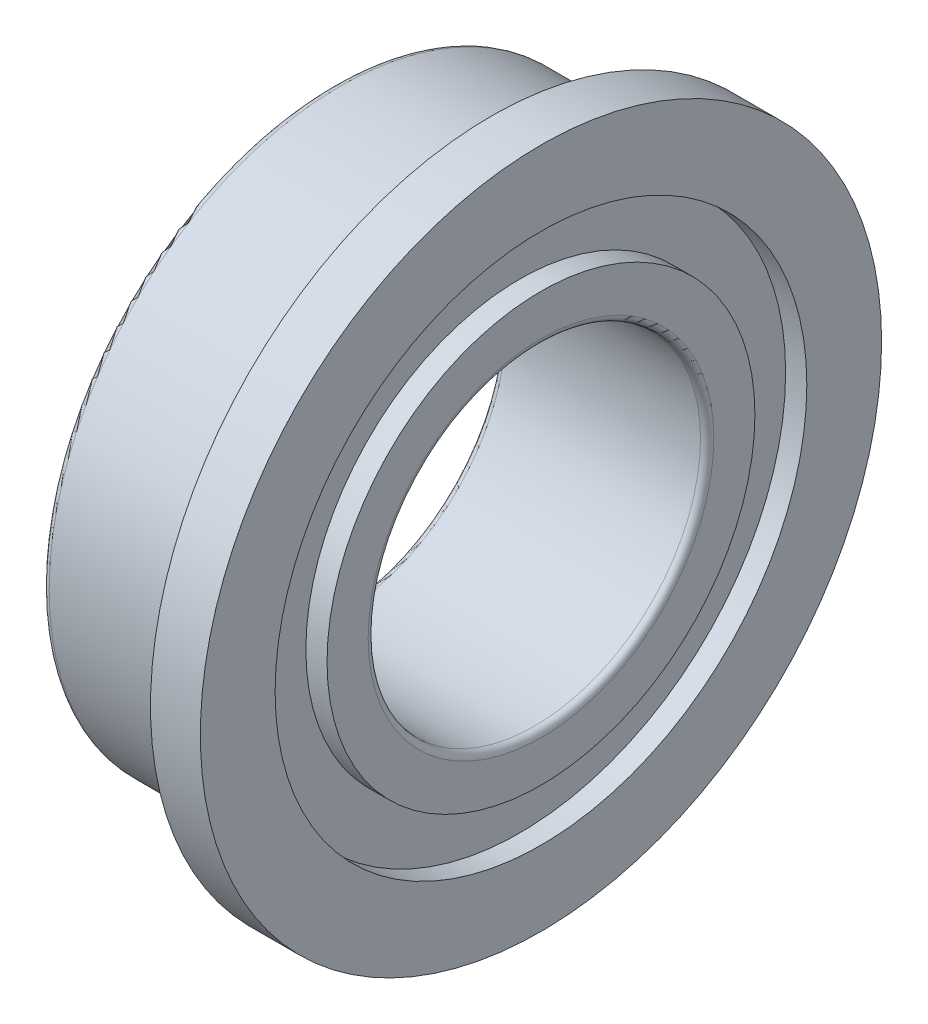
ISO-10303-21;
HEADER;
FILE_DESCRIPTION(('STEP AP214'),'2;1');
FILE_NAME('part.step','',(''),(''),'','','');
FILE_SCHEMA(('AUTOMOTIVE_DESIGN { 1 0 10303 214 1 1 1 1 }'));
ENDSEC;
DATA;
#1=APPLICATION_CONTEXT('core data for automotive mechanical design processes');
#2=APPLICATION_PROTOCOL_DEFINITION('international standard','automotive_design',2000,#1);
#3=PRODUCT_CONTEXT('',#1,'mechanical');
#4=PRODUCT('Part','Part','',(#3));
#5=PRODUCT_RELATED_PRODUCT_CATEGORY('part','',(#4));
#6=PRODUCT_DEFINITION_FORMATION('','',#4);
#7=PRODUCT_DEFINITION_CONTEXT('part definition',#1,'design');
#8=PRODUCT_DEFINITION('design','',#6,#7);
#9=PRODUCT_DEFINITION_SHAPE('','',#8);
#10=(LENGTH_UNIT() NAMED_UNIT(*) SI_UNIT(.MILLI.,.METRE.));
#11=(NAMED_UNIT(*) PLANE_ANGLE_UNIT() SI_UNIT($,.RADIAN.));
#12=(NAMED_UNIT(*) SI_UNIT($,.STERADIAN.) SOLID_ANGLE_UNIT());
#13=UNCERTAINTY_MEASURE_WITH_UNIT(LENGTH_MEASURE(1.E-05),#10,'distance_accuracy_value','');
#14=(GEOMETRIC_REPRESENTATION_CONTEXT(3) GLOBAL_UNCERTAINTY_ASSIGNED_CONTEXT((#13)) GLOBAL_UNIT_ASSIGNED_CONTEXT((#10,
#11,#12)) REPRESENTATION_CONTEXT('',''));
#15=CARTESIAN_POINT('',(0.,0.,0.));
#16=DIRECTION('',(0.,0.,1.));
#17=DIRECTION('',(1.,0.,0.));
#18=AXIS2_PLACEMENT_3D('',#15,#16,#17);
#19=CARTESIAN_POINT('',(0.255,2.8875,0.));
#20=DIRECTION('',(-1.,0.,0.));
#21=DIRECTION('',(0.,0.,1.));
#22=AXIS2_PLACEMENT_3D('',#19,#20,#21);
#23=PLANE('',#22);
#24=CARTESIAN_POINT('',(0.255,0.,0.));
#25=DIRECTION('',(1.,0.,0.));
#26=DIRECTION('',(0.,0.,-1.));
#27=AXIS2_PLACEMENT_3D('',#24,#25,#26);
#28=CIRCLE('',#27,3.2);
#29=CARTESIAN_POINT('',(0.255,0.,-3.2));
#30=VERTEX_POINT('',#29);
#31=EDGE_CURVE('E310',#30,#30,#28,.F.);
#32=ORIENTED_EDGE('',*,*,#31,.T.);
#33=EDGE_LOOP('',(#32));
#34=FACE_BOUND('',#33,.T.);
#35=CARTESIAN_POINT('',(0.255,0.,0.));
#36=DIRECTION('',(1.,0.,0.));
#37=DIRECTION('',(0.,0.,-1.));
#38=AXIS2_PLACEMENT_3D('',#35,#36,#37);
#39=CIRCLE('',#38,2.575);
#40=CARTESIAN_POINT('',(0.255,0.,-2.575));
#41=VERTEX_POINT('',#40);
#42=EDGE_CURVE('E313',#41,#41,#39,.F.);
#43=ORIENTED_EDGE('',*,*,#42,.F.);
#44=EDGE_LOOP('',(#43));
#45=FACE_BOUND('',#44,.T.);
#46=ADVANCED_FACE('F16',(#34,#45),#23,.T.);
#47=CARTESIAN_POINT('',(0.1275,0.,0.));
#48=DIRECTION('',(1.,0.,0.));
#49=DIRECTION('',(0.,0.,-1.));
#50=AXIS2_PLACEMENT_3D('',#47,#48,#49);
#51=CYLINDRICAL_SURFACE('',#50,2.575);
#52=CARTESIAN_POINT('',(0.,0.,0.));
#53=DIRECTION('',(1.,0.,0.));
#54=DIRECTION('',(0.,0.,-1.));
#55=AXIS2_PLACEMENT_3D('',#52,#53,#54);
#56=CIRCLE('',#55,2.575);
#57=CARTESIAN_POINT('',(0.,0.,-2.575));
#58=VERTEX_POINT('',#57);
#59=EDGE_CURVE('E307',#58,#58,#56,.F.);
#60=ORIENTED_EDGE('',*,*,#59,.F.);
#61=EDGE_LOOP('',(#60));
#62=FACE_BOUND('',#61,.T.);
#63=ORIENTED_EDGE('',*,*,#42,.T.);
#64=EDGE_LOOP('',(#63));
#65=FACE_BOUND('',#64,.T.);
#66=ADVANCED_FACE('F341',(#62,#65),#51,.T.);
#67=CARTESIAN_POINT('',(0.1275,0.,0.));
#68=DIRECTION('',(1.,0.,0.));
#69=DIRECTION('',(0.,0.,-1.));
#70=AXIS2_PLACEMENT_3D('',#67,#68,#69);
#71=CYLINDRICAL_SURFACE('',#70,3.2);
#72=ORIENTED_EDGE('',*,*,#31,.F.);
#73=EDGE_LOOP('',(#72));
#74=FACE_BOUND('',#73,.T.);
#75=CARTESIAN_POINT('',(0.,0.,0.));
#76=DIRECTION('',(1.,0.,0.));
#77=DIRECTION('',(0.,0.,-1.));
#78=AXIS2_PLACEMENT_3D('',#75,#76,#77);
#79=CIRCLE('',#78,3.2);
#80=CARTESIAN_POINT('',(0.,0.,-3.2));
#81=VERTEX_POINT('',#80);
#82=EDGE_CURVE('E70',#81,#81,#79,.T.);
#83=ORIENTED_EDGE('',*,*,#82,.F.);
#84=EDGE_LOOP('',(#83));
#85=FACE_BOUND('',#84,.T.);
#86=ADVANCED_FACE('F93',(#74,#85),#71,.F.);
#87=CARTESIAN_POINT('',(0.,2.3275,0.));
#88=DIRECTION('',(-1.,0.,0.));
#89=DIRECTION('',(0.,0.,1.));
#90=AXIS2_PLACEMENT_3D('',#87,#88,#89);
#91=PLANE('',#90);
#92=ORIENTED_EDGE('',*,*,#59,.T.);
#93=EDGE_LOOP('',(#92));
#94=FACE_BOUND('',#93,.T.);
#95=CARTESIAN_POINT('',(0.,0.,0.));
#96=DIRECTION('',(-1.,0.,0.));
#97=DIRECTION('',(0.,0.,1.));
#98=AXIS2_PLACEMENT_3D('',#95,#96,#97);
#99=CIRCLE('',#98,2.08);
#100=CARTESIAN_POINT('',(0.,0.,2.08));
#101=VERTEX_POINT('',#100);
#102=CARTESIAN_POINT('',(0.,2.08,0.));
#103=VERTEX_POINT('',#102);
#104=EDGE_CURVE('E64',#101,#103,#99,.T.);
#105=ORIENTED_EDGE('',*,*,#104,.F.);
#106=CARTESIAN_POINT('',(0.,0.,0.));
#107=DIRECTION('',(-1.,0.,0.));
#108=DIRECTION('',(0.,0.,-1.));
#109=AXIS2_PLACEMENT_3D('',#106,#107,#108);
#110=CIRCLE('',#109,2.08);
#111=CARTESIAN_POINT('',(0.,0.,-2.08));
#112=VERTEX_POINT('',#111);
#113=EDGE_CURVE('E60',#112,#101,#110,.T.);
#114=ORIENTED_EDGE('',*,*,#113,.F.);
#115=CARTESIAN_POINT('',(0.,0.,0.));
#116=DIRECTION('',(-1.,0.,0.));
#117=DIRECTION('',(0.,1.,0.));
#118=AXIS2_PLACEMENT_3D('',#115,#116,#117);
#119=CIRCLE('',#118,2.08);
#120=EDGE_CURVE('E66',#103,#112,#119,.T.);
#121=ORIENTED_EDGE('',*,*,#120,.F.);
#122=EDGE_LOOP('',(#105,#114,#121));
#123=FACE_BOUND('',#122,.T.);
#124=ADVANCED_FACE('F73',(#94,#123),#91,.T.);
#125=CARTESIAN_POINT('',(0.,3.31,0.));
#126=DIRECTION('',(-1.,0.,0.));
#127=DIRECTION('',(0.,0.,1.));
#128=AXIS2_PLACEMENT_3D('',#125,#126,#127);
#129=PLANE('',#128);
#130=CARTESIAN_POINT('',(0.,0.,0.));
#131=DIRECTION('',(1.,0.,0.));
#132=DIRECTION('',(0.,0.,1.));
#133=AXIS2_PLACEMENT_3D('',#130,#131,#132);
#134=CIRCLE('',#133,3.42);
#135=CARTESIAN_POINT('',(0.,0.,3.42));
#136=VERTEX_POINT('',#135);
#137=CARTESIAN_POINT('',(0.,0.,-3.42));
#138=VERTEX_POINT('',#137);
#139=EDGE_CURVE('E143',#136,#138,#134,.T.);
#140=ORIENTED_EDGE('',*,*,#139,.F.);
#141=CARTESIAN_POINT('',(0.,0.,0.));
#142=DIRECTION('',(1.,0.,0.));
#143=DIRECTION('',(0.,1.,0.));
#144=AXIS2_PLACEMENT_3D('',#141,#142,#143);
#145=CIRCLE('',#144,3.42);
#146=CARTESIAN_POINT('',(0.,3.42,0.));
#147=VERTEX_POINT('',#146);
#148=EDGE_CURVE('E153',#147,#136,#145,.T.);
#149=ORIENTED_EDGE('',*,*,#148,.F.);
#150=CARTESIAN_POINT('',(0.,0.,0.));
#151=DIRECTION('',(1.,0.,0.));
#152=DIRECTION('',(0.,0.,-1.));
#153=AXIS2_PLACEMENT_3D('',#150,#151,#152);
#154=CIRCLE('',#153,3.42);
#155=EDGE_CURVE('E132',#138,#147,#154,.T.);
#156=ORIENTED_EDGE('',*,*,#155,.F.);
#157=EDGE_LOOP('',(#140,#149,#156));
#158=FACE_BOUND('',#157,.T.);
#159=ORIENTED_EDGE('',*,*,#82,.T.);
#160=EDGE_LOOP('',(#159));
#161=FACE_BOUND('',#160,.T.);
#162=ADVANCED_FACE('F92',(#158,#161),#129,.T.);
#163=CARTESIAN_POINT('',(0.0800000000000004,0.,0.));
#164=DIRECTION('',(-1.,0.,0.));
#165=DIRECTION('',(0.,0.,1.));
#166=AXIS2_PLACEMENT_3D('',#163,#164,#165);
#167=TOROIDAL_SURFACE('',#166,2.08,0.0800000000000004);
#168=ORIENTED_EDGE('',*,*,#113,.T.);
#169=ORIENTED_EDGE('',*,*,#104,.T.);
#170=ORIENTED_EDGE('',*,*,#120,.T.);
#171=EDGE_LOOP('',(#168,#169,#170));
#172=FACE_BOUND('',#171,.T.);
#173=CARTESIAN_POINT('',(0.08,0.,0.));
#174=DIRECTION('',(1.,0.,0.));
#175=DIRECTION('',(0.,0.,-1.));
#176=AXIS2_PLACEMENT_3D('',#173,#174,#175);
#177=CIRCLE('',#176,2.);
#178=CARTESIAN_POINT('',(0.08,0.,-2.));
#179=VERTEX_POINT('',#178);
#180=EDGE_CURVE('E127',#179,#179,#177,.T.);
#181=ORIENTED_EDGE('',*,*,#180,.T.);
#182=EDGE_LOOP('',(#181));
#183=FACE_BOUND('',#182,.T.);
#184=ADVANCED_FACE('F62',(#172,#183),#167,.T.);
#185=CARTESIAN_POINT('',(0.0800000000000006,0.,0.));
#186=DIRECTION('',(-1.,0.,0.));
#187=DIRECTION('',(0.,0.,1.));
#188=AXIS2_PLACEMENT_3D('',#185,#186,#187);
#189=TOROIDAL_SURFACE('',#188,3.42,0.0800000000000005);
#190=ORIENTED_EDGE('',*,*,#148,.T.);
#191=ORIENTED_EDGE('',*,*,#139,.T.);
#192=ORIENTED_EDGE('',*,*,#155,.T.);
#193=EDGE_LOOP('',(#190,#191,#192));
#194=FACE_BOUND('',#193,.T.);
#195=CARTESIAN_POINT('',(0.0800000000000001,0.,0.));
#196=DIRECTION('',(1.,0.,0.));
#197=DIRECTION('',(0.,0.,-1.));
#198=AXIS2_PLACEMENT_3D('',#195,#196,#197);
#199=CIRCLE('',#198,3.5);
#200=CARTESIAN_POINT('',(0.0800000000000001,0.,-3.5));
#201=VERTEX_POINT('',#200);
#202=EDGE_CURVE('E175',#201,#201,#199,.T.);
#203=ORIENTED_EDGE('',*,*,#202,.F.);
#204=EDGE_LOOP('',(#203));
#205=FACE_BOUND('',#204,.T.);
#206=ADVANCED_FACE('F118',(#194,#205),#189,.T.);
#207=CARTESIAN_POINT('',(1.25,0.,0.));
#208=DIRECTION('',(1.,0.,0.));
#209=DIRECTION('',(0.,0.,-1.));
#210=AXIS2_PLACEMENT_3D('',#207,#208,#209);
#211=CYLINDRICAL_SURFACE('',#210,2.);
#212=ORIENTED_EDGE('',*,*,#180,.F.);
#213=EDGE_LOOP('',(#212));
#214=FACE_BOUND('',#213,.T.);
#215=CARTESIAN_POINT('',(2.42,0.,0.));
#216=DIRECTION('',(-1.,0.,0.));
#217=DIRECTION('',(0.,0.,1.));
#218=AXIS2_PLACEMENT_3D('',#215,#216,#217);
#219=CIRCLE('',#218,2.);
#220=CARTESIAN_POINT('',(2.42,0.,2.));
#221=VERTEX_POINT('',#220);
#222=EDGE_CURVE('E178',#221,#221,#219,.T.);
#223=ORIENTED_EDGE('',*,*,#222,.F.);
#224=EDGE_LOOP('',(#223));
#225=FACE_BOUND('',#224,.T.);
#226=ADVANCED_FACE('F372',(#214,#225),#211,.F.);
#227=CARTESIAN_POINT('',(0.949999999999999,0.,0.));
#228=DIRECTION('',(1.,0.,0.));
#229=DIRECTION('',(0.,0.,-1.));
#230=AXIS2_PLACEMENT_3D('',#227,#228,#229);
#231=CYLINDRICAL_SURFACE('',#230,3.5);
#232=ORIENTED_EDGE('',*,*,#202,.T.);
#233=EDGE_LOOP('',(#232));
#234=FACE_BOUND('',#233,.T.);
#235=CARTESIAN_POINT('',(1.82,0.,0.));
#236=DIRECTION('',(-1.,0.,0.));
#237=DIRECTION('',(0.,0.,1.));
#238=AXIS2_PLACEMENT_3D('',#235,#236,#237);
#239=CIRCLE('',#238,3.5);
#240=CARTESIAN_POINT('',(1.82,0.,3.5));
#241=VERTEX_POINT('',#240);
#242=EDGE_CURVE('E183',#241,#241,#239,.T.);
#243=ORIENTED_EDGE('',*,*,#242,.T.);
#244=EDGE_LOOP('',(#243));
#245=FACE_BOUND('',#244,.T.);
#246=ADVANCED_FACE('F207',(#234,#245),#231,.T.);
#247=CARTESIAN_POINT('',(2.42,0.,0.));
#248=DIRECTION('',(-1.,0.,0.));
#249=DIRECTION('',(0.,0.,1.));
#250=AXIS2_PLACEMENT_3D('',#247,#248,#249);
#251=TOROIDAL_SURFACE('',#250,2.08,0.080000000000001);
#252=ORIENTED_EDGE('',*,*,#222,.T.);
#253=EDGE_LOOP('',(#252));
#254=FACE_BOUND('',#253,.T.);
#255=CARTESIAN_POINT('',(2.5,0.,0.));
#256=DIRECTION('',(1.,0.,0.));
#257=DIRECTION('',(0.,0.,-1.));
#258=AXIS2_PLACEMENT_3D('',#255,#256,#257);
#259=CIRCLE('',#258,2.08);
#260=CARTESIAN_POINT('',(2.5,2.08,0.));
#261=VERTEX_POINT('',#260);
#262=CARTESIAN_POINT('',(2.5,0.,-2.08));
#263=VERTEX_POINT('',#262);
#264=EDGE_CURVE('E189',#261,#263,#259,.F.);
#265=ORIENTED_EDGE('',*,*,#264,.F.);
#266=CARTESIAN_POINT('',(2.5,0.,0.));
#267=DIRECTION('',(1.,0.,0.));
#268=DIRECTION('',(0.,1.,0.));
#269=AXIS2_PLACEMENT_3D('',#266,#267,#268);
#270=CIRCLE('',#269,2.08);
#271=CARTESIAN_POINT('',(2.5,0.,2.08));
#272=VERTEX_POINT('',#271);
#273=EDGE_CURVE('E36',#272,#261,#270,.F.);
#274=ORIENTED_EDGE('',*,*,#273,.F.);
#275=CARTESIAN_POINT('',(2.5,0.,0.));
#276=DIRECTION('',(1.,0.,0.));
#277=DIRECTION('',(0.,0.,1.));
#278=AXIS2_PLACEMENT_3D('',#275,#276,#277);
#279=CIRCLE('',#278,2.08);
#280=EDGE_CURVE('E242',#263,#272,#279,.F.);
#281=ORIENTED_EDGE('',*,*,#280,.F.);
#282=EDGE_LOOP('',(#265,#274,#281));
#283=FACE_BOUND('',#282,.T.);
#284=ADVANCED_FACE('F195',(#254,#283),#251,.T.);
#285=CARTESIAN_POINT('',(2.5,2.3275,0.));
#286=DIRECTION('',(1.,0.,0.));
#287=DIRECTION('',(0.,0.,-1.));
#288=AXIS2_PLACEMENT_3D('',#285,#286,#287);
#289=PLANE('',#288);
#290=ORIENTED_EDGE('',*,*,#280,.T.);
#291=ORIENTED_EDGE('',*,*,#273,.T.);
#292=ORIENTED_EDGE('',*,*,#264,.T.);
#293=EDGE_LOOP('',(#290,#291,#292));
#294=FACE_BOUND('',#293,.T.);
#295=CARTESIAN_POINT('',(2.5,0.,0.));
#296=DIRECTION('',(1.,0.,0.));
#297=DIRECTION('',(0.,0.,-1.));
#298=AXIS2_PLACEMENT_3D('',#295,#296,#297);
#299=CIRCLE('',#298,2.575);
#300=CARTESIAN_POINT('',(2.5,0.,-2.575));
#301=VERTEX_POINT('',#300);
#302=EDGE_CURVE('E302',#301,#301,#299,.F.);
#303=ORIENTED_EDGE('',*,*,#302,.F.);
#304=EDGE_LOOP('',(#303));
#305=FACE_BOUND('',#304,.T.);
#306=ADVANCED_FACE('F206',(#294,#305),#289,.T.);
#307=CARTESIAN_POINT('',(1.9,0.,0.));
#308=DIRECTION('',(-1.,0.,0.));
#309=DIRECTION('',(0.,0.,1.));
#310=AXIS2_PLACEMENT_3D('',#307,#308,#309);
#311=TOROIDAL_SURFACE('',#310,3.5,0.0800000000000001);
#312=ORIENTED_EDGE('',*,*,#242,.F.);
#313=EDGE_LOOP('',(#312));
#314=FACE_BOUND('',#313,.T.);
#315=CARTESIAN_POINT('',(1.9,0.,0.));
#316=DIRECTION('',(-1.,0.,0.));
#317=DIRECTION('',(0.,0.,1.));
#318=AXIS2_PLACEMENT_3D('',#315,#316,#317);
#319=CIRCLE('',#318,3.58);
#320=CARTESIAN_POINT('',(1.9,0.,3.58));
#321=VERTEX_POINT('',#320);
#322=EDGE_CURVE('E299',#321,#321,#319,.F.);
#323=ORIENTED_EDGE('',*,*,#322,.F.);
#324=EDGE_LOOP('',(#323));
#325=FACE_BOUND('',#324,.T.);
#326=ADVANCED_FACE('F253',(#314,#325),#311,.F.);
#327=CARTESIAN_POINT('',(2.3725,0.,0.));
#328=DIRECTION('',(1.,0.,0.));
#329=DIRECTION('',(0.,0.,-1.));
#330=AXIS2_PLACEMENT_3D('',#327,#328,#329);
#331=CYLINDRICAL_SURFACE('',#330,2.575);
#332=CARTESIAN_POINT('',(2.245,0.,0.));
#333=DIRECTION('',(1.,0.,0.));
#334=DIRECTION('',(0.,0.,-1.));
#335=AXIS2_PLACEMENT_3D('',#332,#333,#334);
#336=CIRCLE('',#335,2.575);
#337=CARTESIAN_POINT('',(2.245,0.,-2.575));
#338=VERTEX_POINT('',#337);
#339=EDGE_CURVE('E296',#338,#338,#336,.F.);
#340=ORIENTED_EDGE('',*,*,#339,.F.);
#341=EDGE_LOOP('',(#340));
#342=FACE_BOUND('',#341,.T.);
#343=ORIENTED_EDGE('',*,*,#302,.T.);
#344=EDGE_LOOP('',(#343));
#345=FACE_BOUND('',#344,.T.);
#346=ADVANCED_FACE('F256',(#342,#345),#331,.T.);
#347=CARTESIAN_POINT('',(1.9,3.84,0.));
#348=DIRECTION('',(-1.,0.,0.));
#349=DIRECTION('',(0.,0.,1.));
#350=AXIS2_PLACEMENT_3D('',#347,#348,#349);
#351=PLANE('',#350);
#352=CARTESIAN_POINT('',(1.9,0.,0.));
#353=DIRECTION('',(1.,0.,0.));
#354=DIRECTION('',(0.,0.,-1.));
#355=AXIS2_PLACEMENT_3D('',#352,#353,#354);
#356=CIRCLE('',#355,4.1);
#357=CARTESIAN_POINT('',(1.9,0.,-4.1));
#358=VERTEX_POINT('',#357);
#359=EDGE_CURVE('E291',#358,#358,#356,.T.);
#360=ORIENTED_EDGE('',*,*,#359,.F.);
#361=EDGE_LOOP('',(#360));
#362=FACE_BOUND('',#361,.T.);
#363=ORIENTED_EDGE('',*,*,#322,.T.);
#364=EDGE_LOOP('',(#363));
#365=FACE_BOUND('',#364,.T.);
#366=ADVANCED_FACE('F260',(#362,#365),#351,.T.);
#367=CARTESIAN_POINT('',(2.245,2.8875,0.));
#368=DIRECTION('',(1.,0.,0.));
#369=DIRECTION('',(0.,0.,-1.));
#370=AXIS2_PLACEMENT_3D('',#367,#368,#369);
#371=PLANE('',#370);
#372=ORIENTED_EDGE('',*,*,#339,.T.);
#373=EDGE_LOOP('',(#372));
#374=FACE_BOUND('',#373,.T.);
#375=CARTESIAN_POINT('',(2.245,0.,0.));
#376=DIRECTION('',(1.,0.,0.));
#377=DIRECTION('',(0.,0.,-1.));
#378=AXIS2_PLACEMENT_3D('',#375,#376,#377);
#379=CIRCLE('',#378,3.2);
#380=CARTESIAN_POINT('',(2.245,0.,-3.2));
#381=VERTEX_POINT('',#380);
#382=EDGE_CURVE('E288',#381,#381,#379,.T.);
#383=ORIENTED_EDGE('',*,*,#382,.T.);
#384=EDGE_LOOP('',(#383));
#385=FACE_BOUND('',#384,.T.);
#386=ADVANCED_FACE('F264',(#374,#385),#371,.T.);
#387=CARTESIAN_POINT('',(2.2,0.,0.));
#388=DIRECTION('',(1.,0.,0.));
#389=DIRECTION('',(0.,0.,-1.));
#390=AXIS2_PLACEMENT_3D('',#387,#388,#389);
#391=CYLINDRICAL_SURFACE('',#390,4.1);
#392=ORIENTED_EDGE('',*,*,#359,.T.);
#393=EDGE_LOOP('',(#392));
#394=FACE_BOUND('',#393,.T.);
#395=CARTESIAN_POINT('',(2.5,0.,0.));
#396=DIRECTION('',(1.,0.,0.));
#397=DIRECTION('',(0.,0.,-1.));
#398=AXIS2_PLACEMENT_3D('',#395,#396,#397);
#399=CIRCLE('',#398,4.1);
#400=CARTESIAN_POINT('',(2.5,0.,-4.1));
#401=VERTEX_POINT('',#400);
#402=EDGE_CURVE('E27',#401,#401,#399,.T.);
#403=ORIENTED_EDGE('',*,*,#402,.F.);
#404=EDGE_LOOP('',(#403));
#405=FACE_BOUND('',#404,.T.);
#406=ADVANCED_FACE('F268',(#394,#405),#391,.T.);
#407=CARTESIAN_POINT('',(2.3725,0.,0.));
#408=DIRECTION('',(1.,0.,0.));
#409=DIRECTION('',(0.,0.,-1.));
#410=AXIS2_PLACEMENT_3D('',#407,#408,#409);
#411=CYLINDRICAL_SURFACE('',#410,3.2);
#412=CARTESIAN_POINT('',(2.5,0.,0.));
#413=DIRECTION('',(1.,0.,0.));
#414=DIRECTION('',(0.,0.,-1.));
#415=AXIS2_PLACEMENT_3D('',#412,#413,#414);
#416=CIRCLE('',#415,3.2);
#417=CARTESIAN_POINT('',(2.5,0.,-3.2));
#418=VERTEX_POINT('',#417);
#419=EDGE_CURVE('E11',#418,#418,#416,.F.);
#420=ORIENTED_EDGE('',*,*,#419,.F.);
#421=EDGE_LOOP('',(#420));
#422=FACE_BOUND('',#421,.T.);
#423=ORIENTED_EDGE('',*,*,#382,.F.);
#424=EDGE_LOOP('',(#423));
#425=FACE_BOUND('',#424,.T.);
#426=ADVANCED_FACE('F272',(#422,#425),#411,.F.);
#427=CARTESIAN_POINT('',(2.5,3.65,0.));
#428=DIRECTION('',(1.,0.,0.));
#429=DIRECTION('',(0.,0.,-1.));
#430=AXIS2_PLACEMENT_3D('',#427,#428,#429);
#431=PLANE('',#430);
#432=ORIENTED_EDGE('',*,*,#419,.T.);
#433=EDGE_LOOP('',(#432));
#434=FACE_BOUND('',#433,.T.);
#435=ORIENTED_EDGE('',*,*,#402,.T.);
#436=EDGE_LOOP('',(#435));
#437=FACE_BOUND('',#436,.T.);
#438=ADVANCED_FACE('F276',(#434,#437),#431,.T.);
#439=CLOSED_SHELL('',(#46,#66,#86,#124,#162,#184,#206,#226,#246,#284,#306,#326,#346,#366,#386,
#406,#426,#438));
#440=MANIFOLD_SOLID_BREP('B1',#439);
#441=ADVANCED_BREP_SHAPE_REPRESENTATION('',(#18,#440),#14);
#442=SHAPE_DEFINITION_REPRESENTATION(#9,#441);
ENDSEC;
END-ISO-10303-21;
